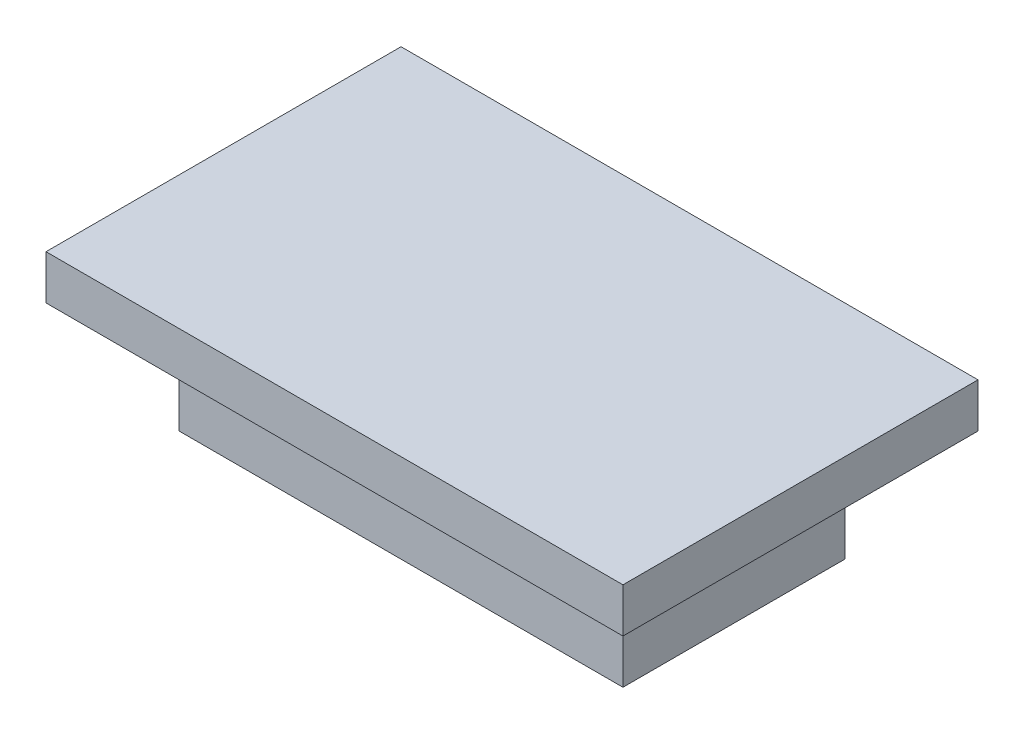
ISO-10303-21;
HEADER;
FILE_DESCRIPTION(('STEP AP214'),'2;1');
FILE_NAME('part.step','',(''),(''),'','','');
FILE_SCHEMA(('AUTOMOTIVE_DESIGN { 1 0 10303 214 1 1 1 1 }'));
ENDSEC;
DATA;
#1=APPLICATION_CONTEXT('core data for automotive mechanical design processes');
#2=APPLICATION_PROTOCOL_DEFINITION('international standard','automotive_design',2000,#1);
#3=PRODUCT_CONTEXT('',#1,'mechanical');
#4=PRODUCT('Part','Part','',(#3));
#5=PRODUCT_RELATED_PRODUCT_CATEGORY('part','',(#4));
#6=PRODUCT_DEFINITION_FORMATION('','',#4);
#7=PRODUCT_DEFINITION_CONTEXT('part definition',#1,'design');
#8=PRODUCT_DEFINITION('design','',#6,#7);
#9=PRODUCT_DEFINITION_SHAPE('','',#8);
#10=(LENGTH_UNIT() NAMED_UNIT(*) SI_UNIT(.MILLI.,.METRE.));
#11=(NAMED_UNIT(*) PLANE_ANGLE_UNIT() SI_UNIT($,.RADIAN.));
#12=(NAMED_UNIT(*) SI_UNIT($,.STERADIAN.) SOLID_ANGLE_UNIT());
#13=UNCERTAINTY_MEASURE_WITH_UNIT(LENGTH_MEASURE(1.E-05),#10,'distance_accuracy_value','');
#14=(GEOMETRIC_REPRESENTATION_CONTEXT(3) GLOBAL_UNCERTAINTY_ASSIGNED_CONTEXT((#13)) GLOBAL_UNIT_ASSIGNED_CONTEXT((#10,
#11,#12)) REPRESENTATION_CONTEXT('',''));
#15=CARTESIAN_POINT('',(0.,0.,0.));
#16=DIRECTION('',(0.,0.,1.));
#17=DIRECTION('',(1.,0.,0.));
#18=AXIS2_PLACEMENT_3D('',#15,#16,#17);
#19=CARTESIAN_POINT('',(0.,5.,0.));
#20=DIRECTION('',(1.,0.,0.));
#21=DIRECTION('',(0.,0.,-1.));
#22=AXIS2_PLACEMENT_3D('',#19,#20,#21);
#23=PLANE('',#22);
#24=DIRECTION('',(0.,0.,1.));
#25=VECTOR('',#24,1.);
#26=CARTESIAN_POINT('',(0.,0.,0.));
#27=LINE('',#26,#25);
#28=CARTESIAN_POINT('',(0.,0.,-10.));
#29=VERTEX_POINT('',#28);
#30=CARTESIAN_POINT('',(0.,0.,0.));
#31=VERTEX_POINT('',#30);
#32=EDGE_CURVE('E125',#29,#31,#27,.T.);
#33=ORIENTED_EDGE('',*,*,#32,.T.);
#34=DIRECTION('',(0.,-1.,0.));
#35=VECTOR('',#34,1.);
#36=CARTESIAN_POINT('',(0.,5.,0.));
#37=LINE('',#36,#35);
#38=CARTESIAN_POINT('',(0.,5.,0.));
#39=VERTEX_POINT('',#38);
#40=EDGE_CURVE('E11',#39,#31,#37,.T.);
#41=ORIENTED_EDGE('',*,*,#40,.F.);
#42=DIRECTION('',(0.,0.,1.));
#43=VECTOR('',#42,1.);
#44=CARTESIAN_POINT('',(0.,5.,0.));
#45=LINE('',#44,#43);
#46=CARTESIAN_POINT('',(0.,5.,-10.));
#47=VERTEX_POINT('',#46);
#48=EDGE_CURVE('E169',#47,#39,#45,.T.);
#49=ORIENTED_EDGE('',*,*,#48,.F.);
#50=DIRECTION('',(0.,-1.,0.));
#51=VECTOR('',#50,1.);
#52=CARTESIAN_POINT('',(0.,5.,-10.));
#53=LINE('',#52,#51);
#54=EDGE_CURVE('E183',#47,#29,#53,.T.);
#55=ORIENTED_EDGE('',*,*,#54,.T.);
#56=EDGE_LOOP('',(#33,#41,#49,#55));
#57=FACE_BOUND('',#56,.T.);
#58=ADVANCED_FACE('F41',(#57),#23,.F.);
#59=CARTESIAN_POINT('',(0.,5.,0.));
#60=DIRECTION('',(0.,0.,-1.));
#61=DIRECTION('',(-1.,0.,0.));
#62=AXIS2_PLACEMENT_3D('',#59,#60,#61);
#63=PLANE('',#62);
#64=DIRECTION('',(1.,0.,0.));
#65=VECTOR('',#64,1.);
#66=CARTESIAN_POINT('',(0.,0.,0.));
#67=LINE('',#66,#65);
#68=CARTESIAN_POINT('',(20.,0.,0.));
#69=VERTEX_POINT('',#68);
#70=EDGE_CURVE('E187',#31,#69,#67,.T.);
#71=ORIENTED_EDGE('',*,*,#70,.T.);
#72=DIRECTION('',(0.,-1.,0.));
#73=VECTOR('',#72,1.);
#74=CARTESIAN_POINT('',(20.,5.,0.));
#75=LINE('',#74,#73);
#76=CARTESIAN_POINT('',(20.,5.,0.));
#77=VERTEX_POINT('',#76);
#78=EDGE_CURVE('E50',#77,#69,#75,.T.);
#79=ORIENTED_EDGE('',*,*,#78,.F.);
#80=DIRECTION('',(1.,0.,0.));
#81=VECTOR('',#80,1.);
#82=CARTESIAN_POINT('',(0.,5.,0.));
#83=LINE('',#82,#81);
#84=EDGE_CURVE('E84',#39,#77,#83,.T.);
#85=ORIENTED_EDGE('',*,*,#84,.F.);
#86=ORIENTED_EDGE('',*,*,#40,.T.);
#87=EDGE_LOOP('',(#71,#79,#85,#86));
#88=FACE_BOUND('',#87,.T.);
#89=ADVANCED_FACE('F218',(#88),#63,.F.);
#90=CARTESIAN_POINT('',(20.,5.,0.));
#91=DIRECTION('',(-1.,0.,0.));
#92=DIRECTION('',(0.,0.,1.));
#93=AXIS2_PLACEMENT_3D('',#90,#91,#92);
#94=PLANE('',#93);
#95=DIRECTION('',(0.,0.,-1.));
#96=VECTOR('',#95,1.);
#97=CARTESIAN_POINT('',(20.,0.,0.));
#98=LINE('',#97,#96);
#99=CARTESIAN_POINT('',(20.,0.,-10.));
#100=VERTEX_POINT('',#99);
#101=EDGE_CURVE('E74',#69,#100,#98,.T.);
#102=ORIENTED_EDGE('',*,*,#101,.T.);
#103=DIRECTION('',(0.,-1.,0.));
#104=VECTOR('',#103,1.);
#105=CARTESIAN_POINT('',(20.,5.,-10.));
#106=LINE('',#105,#104);
#107=CARTESIAN_POINT('',(20.,5.,-10.));
#108=VERTEX_POINT('',#107);
#109=EDGE_CURVE('E58',#108,#100,#106,.T.);
#110=ORIENTED_EDGE('',*,*,#109,.F.);
#111=DIRECTION('',(0.,0.,-1.));
#112=VECTOR('',#111,1.);
#113=CARTESIAN_POINT('',(20.,5.,0.));
#114=LINE('',#113,#112);
#115=EDGE_CURVE('E175',#77,#108,#114,.T.);
#116=ORIENTED_EDGE('',*,*,#115,.F.);
#117=ORIENTED_EDGE('',*,*,#78,.T.);
#118=EDGE_LOOP('',(#102,#110,#116,#117));
#119=FACE_BOUND('',#118,.T.);
#120=ADVANCED_FACE('F198',(#119),#94,.F.);
#121=CARTESIAN_POINT('',(0.,5.,-10.));
#122=DIRECTION('',(0.,0.,1.));
#123=DIRECTION('',(1.,0.,0.));
#124=AXIS2_PLACEMENT_3D('',#121,#122,#123);
#125=PLANE('',#124);
#126=DIRECTION('',(-1.,0.,0.));
#127=VECTOR('',#126,1.);
#128=CARTESIAN_POINT('',(0.,0.,-10.));
#129=LINE('',#128,#127);
#130=EDGE_CURVE('E79',#100,#29,#129,.T.);
#131=ORIENTED_EDGE('',*,*,#130,.T.);
#132=ORIENTED_EDGE('',*,*,#54,.F.);
#133=DIRECTION('',(-1.,0.,0.));
#134=VECTOR('',#133,1.);
#135=CARTESIAN_POINT('',(0.,5.,-10.));
#136=LINE('',#135,#134);
#137=EDGE_CURVE('E179',#108,#47,#136,.T.);
#138=ORIENTED_EDGE('',*,*,#137,.F.);
#139=ORIENTED_EDGE('',*,*,#109,.T.);
#140=EDGE_LOOP('',(#131,#132,#138,#139));
#141=FACE_BOUND('',#140,.T.);
#142=ADVANCED_FACE('F203',(#141),#125,.F.);
#143=CARTESIAN_POINT('',(0.,0.,0.));
#144=DIRECTION('',(0.,-1.,0.));
#145=DIRECTION('',(0.,0.,-1.));
#146=AXIS2_PLACEMENT_3D('',#143,#144,#145);
#147=PLANE('',#146);
#148=ORIENTED_EDGE('',*,*,#32,.F.);
#149=ORIENTED_EDGE('',*,*,#130,.F.);
#150=ORIENTED_EDGE('',*,*,#101,.F.);
#151=ORIENTED_EDGE('',*,*,#70,.F.);
#152=EDGE_LOOP('',(#148,#149,#150,#151));
#153=FACE_BOUND('',#152,.T.);
#154=ADVANCED_FACE('F201',(#153),#147,.T.);
#155=CARTESIAN_POINT('',(0.,5.,0.));
#156=DIRECTION('',(0.,1.,0.));
#157=DIRECTION('',(0.,0.,1.));
#158=AXIS2_PLACEMENT_3D('',#155,#156,#157);
#159=PLANE('',#158);
#160=DIRECTION('',(0.,0.,-1.));
#161=VECTOR('',#160,1.);
#162=CARTESIAN_POINT('',(-3.,5.,0.));
#163=LINE('',#162,#161);
#164=CARTESIAN_POINT('',(-3.,5.,3.));
#165=VERTEX_POINT('',#164);
#166=CARTESIAN_POINT('',(-3.,5.,-13.));
#167=VERTEX_POINT('',#166);
#168=EDGE_CURVE('E121',#165,#167,#163,.T.);
#169=ORIENTED_EDGE('',*,*,#168,.T.);
#170=DIRECTION('',(-1.,0.,0.));
#171=VECTOR('',#170,1.);
#172=CARTESIAN_POINT('',(0.,5.,-13.));
#173=LINE('',#172,#171);
#174=CARTESIAN_POINT('',(23.,5.,-13.));
#175=VERTEX_POINT('',#174);
#176=EDGE_CURVE('E142',#175,#167,#173,.T.);
#177=ORIENTED_EDGE('',*,*,#176,.F.);
#178=DIRECTION('',(0.,0.,-1.));
#179=VECTOR('',#178,1.);
#180=CARTESIAN_POINT('',(23.,5.,0.));
#181=LINE('',#180,#179);
#182=CARTESIAN_POINT('',(23.,5.,3.));
#183=VERTEX_POINT('',#182);
#184=EDGE_CURVE('E146',#183,#175,#181,.T.);
#185=ORIENTED_EDGE('',*,*,#184,.F.);
#186=DIRECTION('',(1.,0.,0.));
#187=VECTOR('',#186,1.);
#188=CARTESIAN_POINT('',(0.,5.,3.));
#189=LINE('',#188,#187);
#190=EDGE_CURVE('E156',#165,#183,#189,.T.);
#191=ORIENTED_EDGE('',*,*,#190,.F.);
#192=EDGE_LOOP('',(#169,#177,#185,#191));
#193=FACE_BOUND('',#192,.T.);
#194=ORIENTED_EDGE('',*,*,#137,.T.);
#195=ORIENTED_EDGE('',*,*,#48,.T.);
#196=ORIENTED_EDGE('',*,*,#84,.T.);
#197=ORIENTED_EDGE('',*,*,#115,.T.);
#198=EDGE_LOOP('',(#194,#195,#196,#197));
#199=FACE_BOUND('',#198,.T.);
#200=ADVANCED_FACE('F205',(#193,#199),#159,.F.);
#201=CARTESIAN_POINT('',(-3.,7.,0.));
#202=DIRECTION('',(-1.,0.,0.));
#203=DIRECTION('',(0.,0.,1.));
#204=AXIS2_PLACEMENT_3D('',#201,#202,#203);
#205=PLANE('',#204);
#206=ORIENTED_EDGE('',*,*,#168,.F.);
#207=DIRECTION('',(0.,-1.,0.));
#208=VECTOR('',#207,1.);
#209=CARTESIAN_POINT('',(-3.,7.,3.));
#210=LINE('',#209,#208);
#211=CARTESIAN_POINT('',(-3.,7.,3.));
#212=VERTEX_POINT('',#211);
#213=EDGE_CURVE('E115',#212,#165,#210,.T.);
#214=ORIENTED_EDGE('',*,*,#213,.F.);
#215=DIRECTION('',(0.,0.,-1.));
#216=VECTOR('',#215,1.);
#217=CARTESIAN_POINT('',(-3.,7.,0.));
#218=LINE('',#217,#216);
#219=CARTESIAN_POINT('',(-3.,7.,-13.));
#220=VERTEX_POINT('',#219);
#221=EDGE_CURVE('E119',#212,#220,#218,.T.);
#222=ORIENTED_EDGE('',*,*,#221,.T.);
#223=DIRECTION('',(0.,-1.,0.));
#224=VECTOR('',#223,1.);
#225=CARTESIAN_POINT('',(-3.,7.,-13.));
#226=LINE('',#225,#224);
#227=EDGE_CURVE('E153',#220,#167,#226,.T.);
#228=ORIENTED_EDGE('',*,*,#227,.T.);
#229=EDGE_LOOP('',(#206,#214,#222,#228));
#230=FACE_BOUND('',#229,.T.);
#231=ADVANCED_FACE('F117',(#230),#205,.T.);
#232=CARTESIAN_POINT('',(0.,7.,3.));
#233=DIRECTION('',(0.,0.,-1.));
#234=DIRECTION('',(-1.,0.,0.));
#235=AXIS2_PLACEMENT_3D('',#232,#233,#234);
#236=PLANE('',#235);
#237=ORIENTED_EDGE('',*,*,#190,.T.);
#238=DIRECTION('',(0.,-1.,0.));
#239=VECTOR('',#238,1.);
#240=CARTESIAN_POINT('',(23.,7.,3.));
#241=LINE('',#240,#239);
#242=CARTESIAN_POINT('',(23.,7.,3.));
#243=VERTEX_POINT('',#242);
#244=EDGE_CURVE('E126',#243,#183,#241,.T.);
#245=ORIENTED_EDGE('',*,*,#244,.F.);
#246=DIRECTION('',(1.,0.,0.));
#247=VECTOR('',#246,1.);
#248=CARTESIAN_POINT('',(0.,7.,3.));
#249=LINE('',#248,#247);
#250=EDGE_CURVE('E129',#212,#243,#249,.T.);
#251=ORIENTED_EDGE('',*,*,#250,.F.);
#252=ORIENTED_EDGE('',*,*,#213,.T.);
#253=EDGE_LOOP('',(#237,#245,#251,#252));
#254=FACE_BOUND('',#253,.T.);
#255=ADVANCED_FACE('F130',(#254),#236,.F.);
#256=CARTESIAN_POINT('',(23.,7.,0.));
#257=DIRECTION('',(-1.,0.,0.));
#258=DIRECTION('',(0.,0.,1.));
#259=AXIS2_PLACEMENT_3D('',#256,#257,#258);
#260=PLANE('',#259);
#261=ORIENTED_EDGE('',*,*,#184,.T.);
#262=DIRECTION('',(0.,-1.,0.));
#263=VECTOR('',#262,1.);
#264=CARTESIAN_POINT('',(23.,7.,-13.));
#265=LINE('',#264,#263);
#266=CARTESIAN_POINT('',(23.,7.,-13.));
#267=VERTEX_POINT('',#266);
#268=EDGE_CURVE('E163',#267,#175,#265,.T.);
#269=ORIENTED_EDGE('',*,*,#268,.F.);
#270=DIRECTION('',(0.,0.,-1.));
#271=VECTOR('',#270,1.);
#272=CARTESIAN_POINT('',(23.,7.,0.));
#273=LINE('',#272,#271);
#274=EDGE_CURVE('E135',#243,#267,#273,.T.);
#275=ORIENTED_EDGE('',*,*,#274,.F.);
#276=ORIENTED_EDGE('',*,*,#244,.T.);
#277=EDGE_LOOP('',(#261,#269,#275,#276));
#278=FACE_BOUND('',#277,.T.);
#279=ADVANCED_FACE('F231',(#278),#260,.F.);
#280=CARTESIAN_POINT('',(0.,7.,-13.));
#281=DIRECTION('',(0.,0.,1.));
#282=DIRECTION('',(1.,0.,0.));
#283=AXIS2_PLACEMENT_3D('',#280,#281,#282);
#284=PLANE('',#283);
#285=ORIENTED_EDGE('',*,*,#176,.T.);
#286=ORIENTED_EDGE('',*,*,#227,.F.);
#287=DIRECTION('',(-1.,0.,0.));
#288=VECTOR('',#287,1.);
#289=CARTESIAN_POINT('',(0.,7.,-13.));
#290=LINE('',#289,#288);
#291=EDGE_CURVE('E139',#267,#220,#290,.T.);
#292=ORIENTED_EDGE('',*,*,#291,.F.);
#293=ORIENTED_EDGE('',*,*,#268,.T.);
#294=EDGE_LOOP('',(#285,#286,#292,#293));
#295=FACE_BOUND('',#294,.T.);
#296=ADVANCED_FACE('F233',(#295),#284,.F.);
#297=CARTESIAN_POINT('',(0.,7.,0.));
#298=DIRECTION('',(0.,1.,0.));
#299=DIRECTION('',(0.,0.,1.));
#300=AXIS2_PLACEMENT_3D('',#297,#298,#299);
#301=PLANE('',#300);
#302=ORIENTED_EDGE('',*,*,#221,.F.);
#303=ORIENTED_EDGE('',*,*,#250,.T.);
#304=ORIENTED_EDGE('',*,*,#274,.T.);
#305=ORIENTED_EDGE('',*,*,#291,.T.);
#306=EDGE_LOOP('',(#302,#303,#304,#305));
#307=FACE_BOUND('',#306,.T.);
#308=ADVANCED_FACE('F137',(#307),#301,.T.);
#309=CLOSED_SHELL('',(#58,#89,#120,#142,#154,#200,#231,#255,#279,#296,#308));
#310=MANIFOLD_SOLID_BREP('B2',#309);
#311=ADVANCED_BREP_SHAPE_REPRESENTATION('',(#18,#310),#14);
#312=SHAPE_DEFINITION_REPRESENTATION(#9,#311);
ENDSEC;
END-ISO-10303-21;
